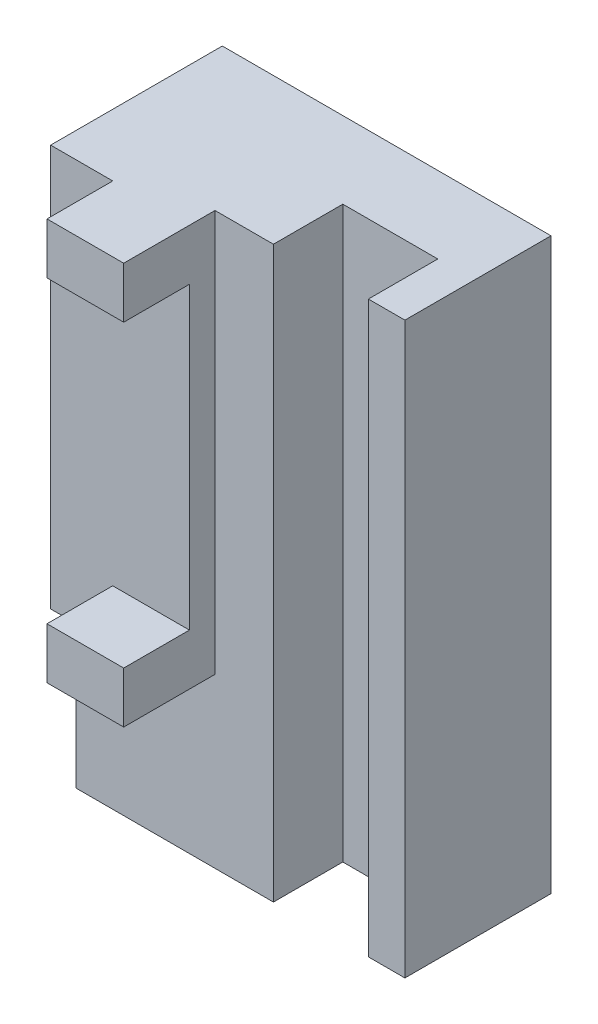
ISO-10303-21;
HEADER;
FILE_DESCRIPTION(('STEP AP214'),'2;1');
FILE_NAME('part.step','',(''),(''),'','','');
FILE_SCHEMA(('AUTOMOTIVE_DESIGN { 1 0 10303 214 1 1 1 1 }'));
ENDSEC;
DATA;
#1=APPLICATION_CONTEXT('core data for automotive mechanical design processes');
#2=APPLICATION_PROTOCOL_DEFINITION('international standard','automotive_design',2000,#1);
#3=PRODUCT_CONTEXT('',#1,'mechanical');
#4=PRODUCT('Part','Part','',(#3));
#5=PRODUCT_RELATED_PRODUCT_CATEGORY('part','',(#4));
#6=PRODUCT_DEFINITION_FORMATION('','',#4);
#7=PRODUCT_DEFINITION_CONTEXT('part definition',#1,'design');
#8=PRODUCT_DEFINITION('design','',#6,#7);
#9=PRODUCT_DEFINITION_SHAPE('','',#8);
#10=(LENGTH_UNIT() NAMED_UNIT(*) SI_UNIT(.MILLI.,.METRE.));
#11=(NAMED_UNIT(*) PLANE_ANGLE_UNIT() SI_UNIT($,.RADIAN.));
#12=(NAMED_UNIT(*) SI_UNIT($,.STERADIAN.) SOLID_ANGLE_UNIT());
#13=UNCERTAINTY_MEASURE_WITH_UNIT(LENGTH_MEASURE(1.E-05),#10,'distance_accuracy_value','');
#14=(GEOMETRIC_REPRESENTATION_CONTEXT(3) GLOBAL_UNCERTAINTY_ASSIGNED_CONTEXT((#13)) GLOBAL_UNIT_ASSIGNED_CONTEXT((#10,
#11,#12)) REPRESENTATION_CONTEXT('',''));
#15=CARTESIAN_POINT('',(0.,0.,0.));
#16=DIRECTION('',(0.,0.,1.));
#17=DIRECTION('',(1.,0.,0.));
#18=AXIS2_PLACEMENT_3D('',#15,#16,#17);
#19=CARTESIAN_POINT('',(0.,0.,20.));
#20=DIRECTION('',(0.,0.,1.));
#21=DIRECTION('',(1.,0.,0.));
#22=AXIS2_PLACEMENT_3D('',#19,#20,#21);
#23=PLANE('',#22);
#24=DIRECTION('',(1.,0.,0.));
#25=VECTOR('',#24,1.);
#26=CARTESIAN_POINT('',(-20.2780898876404,0.575842696629199,20.));
#27=LINE('',#26,#25);
#28=CARTESIAN_POINT('',(-28.7780898876404,0.575842696629199,20.));
#29=VERTEX_POINT('',#28);
#30=CARTESIAN_POINT('',(-9.77808988764043,0.575842696629199,20.));
#31=VERTEX_POINT('',#30);
#32=EDGE_CURVE('E297',#29,#31,#27,.T.);
#33=ORIENTED_EDGE('',*,*,#32,.F.);
#34=DIRECTION('',(0.,-1.,0.));
#35=VECTOR('',#34,1.);
#36=CARTESIAN_POINT('',(-28.7780898876404,55.5758426966292,20.));
#37=LINE('',#36,#35);
#38=CARTESIAN_POINT('',(-28.7780898876404,-22.4241573033708,20.));
#39=VERTEX_POINT('',#38);
#40=EDGE_CURVE('E217',#29,#39,#37,.T.);
#41=ORIENTED_EDGE('',*,*,#40,.T.);
#42=DIRECTION('',(1.,0.,0.));
#43=VECTOR('',#42,1.);
#44=CARTESIAN_POINT('',(-28.7780898876404,-22.4241573033708,20.));
#45=LINE('',#44,#43);
#46=CARTESIAN_POINT('',(-1.77808988764044,-22.4241573033708,20.));
#47=VERTEX_POINT('',#46);
#48=EDGE_CURVE('E221',#39,#47,#45,.T.);
#49=ORIENTED_EDGE('',*,*,#48,.T.);
#50=DIRECTION('',(0.,-1.,0.));
#51=VECTOR('',#50,1.);
#52=CARTESIAN_POINT('',(-1.77808988764044,55.5758426966292,20.));
#53=LINE('',#52,#51);
#54=CARTESIAN_POINT('',(-1.77808988764044,55.5758426966292,20.));
#55=VERTEX_POINT('',#54);
#56=EDGE_CURVE('E208',#55,#47,#53,.T.);
#57=ORIENTED_EDGE('',*,*,#56,.F.);
#58=DIRECTION('',(-1.,0.,0.));
#59=VECTOR('',#58,1.);
#60=CARTESIAN_POINT('',(-28.7780898876404,55.5758426966292,20.));
#61=LINE('',#60,#59);
#62=CARTESIAN_POINT('',(-9.77808988764044,55.5758426966292,20.));
#63=VERTEX_POINT('',#62);
#64=EDGE_CURVE('E226',#55,#63,#61,.T.);
#65=ORIENTED_EDGE('',*,*,#64,.T.);
#66=DIRECTION('',(0.,1.,0.));
#67=VECTOR('',#66,1.);
#68=CARTESIAN_POINT('',(-9.77808988764044,55.5758426966292,20.));
#69=LINE('',#68,#67);
#70=EDGE_CURVE('E180',#31,#63,#69,.T.);
#71=ORIENTED_EDGE('',*,*,#70,.F.);
#72=EDGE_LOOP('',(#33,#41,#49,#57,#65,#71));
#73=FACE_BOUND('',#72,.T.);
#74=ADVANCED_FACE('F34',(#73),#23,.T.);
#75=CARTESIAN_POINT('',(-20.2780898876404,55.5758426966292,23.5));
#76=DIRECTION('',(1.,0.,0.));
#77=DIRECTION('',(0.,1.,0.));
#78=AXIS2_PLACEMENT_3D('',#75,#76,#77);
#79=PLANE('',#78);
#80=DIRECTION('',(0.,1.,0.));
#81=VECTOR('',#80,1.);
#82=CARTESIAN_POINT('',(-20.2780898876404,55.5758426966292,23.5));
#83=LINE('',#82,#81);
#84=CARTESIAN_POINT('',(-20.2780898876404,0.5758426966292,23.5));
#85=VERTEX_POINT('',#84);
#86=CARTESIAN_POINT('',(-20.2780898876404,7.5758426966292,23.5));
#87=VERTEX_POINT('',#86);
#88=EDGE_CURVE('E160',#85,#87,#83,.T.);
#89=ORIENTED_EDGE('',*,*,#88,.F.);
#90=DIRECTION('',(0.,0.,-1.));
#91=VECTOR('',#90,1.);
#92=CARTESIAN_POINT('',(-20.2780898876404,0.575842696629199,23.5));
#93=LINE('',#92,#91);
#94=CARTESIAN_POINT('',(-20.2780898876404,0.575842696629198,32.5));
#95=VERTEX_POINT('',#94);
#96=EDGE_CURVE('E187',#95,#85,#93,.T.);
#97=ORIENTED_EDGE('',*,*,#96,.F.);
#98=DIRECTION('',(0.,-1.,0.));
#99=VECTOR('',#98,1.);
#100=CARTESIAN_POINT('',(-20.2780898876404,0.575842696629198,32.5));
#101=LINE('',#100,#99);
#102=CARTESIAN_POINT('',(-20.2780898876404,7.5758426966292,32.5));
#103=VERTEX_POINT('',#102);
#104=EDGE_CURVE('E285',#103,#95,#101,.T.);
#105=ORIENTED_EDGE('',*,*,#104,.F.);
#106=DIRECTION('',(0.,0.,-1.));
#107=VECTOR('',#106,1.);
#108=CARTESIAN_POINT('',(-20.2780898876404,7.5758426966292,32.5));
#109=LINE('',#108,#107);
#110=EDGE_CURVE('E291',#103,#87,#109,.T.);
#111=ORIENTED_EDGE('',*,*,#110,.T.);
#112=EDGE_LOOP('',(#89,#97,#105,#111));
#113=FACE_BOUND('',#112,.T.);
#114=ADVANCED_FACE('F325',(#113),#79,.F.);
#115=CARTESIAN_POINT('',(-20.2780898876404,48.5758426966292,23.5));
#116=VERTEX_POINT('',#115);
#117=CARTESIAN_POINT('',(-20.2780898876404,55.5758426966292,23.5));
#118=VERTEX_POINT('',#117);
#119=EDGE_CURVE('E150',#116,#118,#83,.T.);
#120=ORIENTED_EDGE('',*,*,#119,.F.);
#121=DIRECTION('',(0.,0.,-1.));
#122=VECTOR('',#121,1.);
#123=CARTESIAN_POINT('',(-20.2780898876404,48.5758426966292,32.5));
#124=LINE('',#123,#122);
#125=CARTESIAN_POINT('',(-20.2780898876404,48.5758426966292,32.5));
#126=VERTEX_POINT('',#125);
#127=EDGE_CURVE('E278',#126,#116,#124,.T.);
#128=ORIENTED_EDGE('',*,*,#127,.F.);
#129=DIRECTION('',(0.,-1.,0.));
#130=VECTOR('',#129,1.);
#131=CARTESIAN_POINT('',(-20.2780898876404,55.5758426966292,32.5));
#132=LINE('',#131,#130);
#133=CARTESIAN_POINT('',(-20.2780898876404,55.5758426966292,32.5));
#134=VERTEX_POINT('',#133);
#135=EDGE_CURVE('E174',#134,#126,#132,.T.);
#136=ORIENTED_EDGE('',*,*,#135,.F.);
#137=DIRECTION('',(0.,0.,-1.));
#138=VECTOR('',#137,1.);
#139=CARTESIAN_POINT('',(-20.2780898876404,55.5758426966292,23.5));
#140=LINE('',#139,#138);
#141=EDGE_CURVE('E165',#134,#118,#140,.T.);
#142=ORIENTED_EDGE('',*,*,#141,.T.);
#143=EDGE_LOOP('',(#120,#128,#136,#142));
#144=FACE_BOUND('',#143,.T.);
#145=ADVANCED_FACE('F172',(#144),#79,.F.);
#146=CARTESIAN_POINT('',(0.,0.,23.5));
#147=DIRECTION('',(0.,0.,1.));
#148=DIRECTION('',(1.,0.,0.));
#149=AXIS2_PLACEMENT_3D('',#146,#147,#148);
#150=PLANE('',#149);
#151=DIRECTION('',(0.,1.,0.));
#152=VECTOR('',#151,1.);
#153=CARTESIAN_POINT('',(-9.77808988764044,55.5758426966292,23.5));
#154=LINE('',#153,#152);
#155=CARTESIAN_POINT('',(-9.77808988764044,7.5758426966292,23.5));
#156=VERTEX_POINT('',#155);
#157=CARTESIAN_POINT('',(-9.77808988764044,48.5758426966292,23.5));
#158=VERTEX_POINT('',#157);
#159=EDGE_CURVE('E49',#156,#158,#154,.T.);
#160=ORIENTED_EDGE('',*,*,#159,.T.);
#161=DIRECTION('',(1.,0.,0.));
#162=VECTOR('',#161,1.);
#163=CARTESIAN_POINT('',(-20.2780898876404,48.5758426966292,23.5));
#164=LINE('',#163,#162);
#165=EDGE_CURVE('E155',#116,#158,#164,.T.);
#166=ORIENTED_EDGE('',*,*,#165,.F.);
#167=ORIENTED_EDGE('',*,*,#119,.T.);
#168=DIRECTION('',(-1.,0.,0.));
#169=VECTOR('',#168,1.);
#170=CARTESIAN_POINT('',(-20.2780898876404,55.5758426966292,23.5));
#171=LINE('',#170,#169);
#172=CARTESIAN_POINT('',(-28.7780898876404,55.5758426966292,23.5));
#173=VERTEX_POINT('',#172);
#174=EDGE_CURVE('E153',#118,#173,#171,.T.);
#175=ORIENTED_EDGE('',*,*,#174,.T.);
#176=DIRECTION('',(0.,-1.,0.));
#177=VECTOR('',#176,1.);
#178=CARTESIAN_POINT('',(-28.7780898876404,55.5758426966292,23.5));
#179=LINE('',#178,#177);
#180=CARTESIAN_POINT('',(-28.7780898876404,0.575842696629199,23.5));
#181=VERTEX_POINT('',#180);
#182=EDGE_CURVE('E169',#173,#181,#179,.T.);
#183=ORIENTED_EDGE('',*,*,#182,.T.);
#184=DIRECTION('',(1.,0.,0.));
#185=VECTOR('',#184,1.);
#186=CARTESIAN_POINT('',(-20.2780898876404,0.5758426966292,23.5));
#187=LINE('',#186,#185);
#188=EDGE_CURVE('E261',#181,#85,#187,.T.);
#189=ORIENTED_EDGE('',*,*,#188,.T.);
#190=ORIENTED_EDGE('',*,*,#88,.T.);
#191=DIRECTION('',(-1.,0.,0.));
#192=VECTOR('',#191,1.);
#193=CARTESIAN_POINT('',(-9.77808988764043,7.5758426966292,23.5));
#194=LINE('',#193,#192);
#195=EDGE_CURVE('E54',#156,#87,#194,.T.);
#196=ORIENTED_EDGE('',*,*,#195,.F.);
#197=EDGE_LOOP('',(#160,#166,#167,#175,#183,#189,#190,#196));
#198=FACE_BOUND('',#197,.T.);
#199=ADVANCED_FACE('F152',(#198),#150,.T.);
#200=CARTESIAN_POINT('',(-28.7780898876404,55.5758426966292,20.));
#201=DIRECTION('',(1.,0.,0.));
#202=DIRECTION('',(0.,1.,0.));
#203=AXIS2_PLACEMENT_3D('',#200,#201,#202);
#204=PLANE('',#203);
#205=DIRECTION('',(0.,-1.,0.));
#206=VECTOR('',#205,1.);
#207=CARTESIAN_POINT('',(-28.7780898876404,55.5758426966292,0.));
#208=LINE('',#207,#206);
#209=CARTESIAN_POINT('',(-28.7780898876404,55.5758426966292,0.));
#210=VERTEX_POINT('',#209);
#211=CARTESIAN_POINT('',(-28.7780898876404,-22.4241573033708,0.));
#212=VERTEX_POINT('',#211);
#213=EDGE_CURVE('E210',#210,#212,#208,.T.);
#214=ORIENTED_EDGE('',*,*,#213,.T.);
#215=DIRECTION('',(0.,0.,-1.));
#216=VECTOR('',#215,1.);
#217=CARTESIAN_POINT('',(-28.7780898876404,-22.4241573033708,20.));
#218=LINE('',#217,#216);
#219=EDGE_CURVE('E11',#39,#212,#218,.T.);
#220=ORIENTED_EDGE('',*,*,#219,.F.);
#221=ORIENTED_EDGE('',*,*,#40,.F.);
#222=DIRECTION('',(0.,0.,-1.));
#223=VECTOR('',#222,1.);
#224=CARTESIAN_POINT('',(-28.7780898876404,0.575842696629199,23.5));
#225=LINE('',#224,#223);
#226=EDGE_CURVE('E259',#181,#29,#225,.T.);
#227=ORIENTED_EDGE('',*,*,#226,.F.);
#228=ORIENTED_EDGE('',*,*,#182,.F.);
#229=DIRECTION('',(0.,0.,-1.));
#230=VECTOR('',#229,1.);
#231=CARTESIAN_POINT('',(-28.7780898876404,55.5758426966292,20.));
#232=LINE('',#231,#230);
#233=EDGE_CURVE('E168',#173,#210,#232,.T.);
#234=ORIENTED_EDGE('',*,*,#233,.T.);
#235=EDGE_LOOP('',(#214,#220,#221,#227,#228,#234));
#236=FACE_BOUND('',#235,.T.);
#237=ADVANCED_FACE('F36',(#236),#204,.F.);
#238=CARTESIAN_POINT('',(-28.7780898876404,-22.4241573033708,20.));
#239=DIRECTION('',(0.,1.,0.));
#240=DIRECTION('',(0.,0.,1.));
#241=AXIS2_PLACEMENT_3D('',#238,#239,#240);
#242=PLANE('',#241);
#243=DIRECTION('',(1.,0.,0.));
#244=VECTOR('',#243,1.);
#245=CARTESIAN_POINT('',(-1.77808988764044,-22.4241573033708,10.5));
#246=LINE('',#245,#244);
#247=CARTESIAN_POINT('',(-1.77808988764044,-22.4241573033708,10.5));
#248=VERTEX_POINT('',#247);
#249=CARTESIAN_POINT('',(11.2219101123596,-22.4241573033708,10.5));
#250=VERTEX_POINT('',#249);
#251=EDGE_CURVE('E204',#248,#250,#246,.T.);
#252=ORIENTED_EDGE('',*,*,#251,.F.);
#253=DIRECTION('',(0.,0.,-1.));
#254=VECTOR('',#253,1.);
#255=CARTESIAN_POINT('',(-1.77808988764044,-22.4241573033708,20.));
#256=LINE('',#255,#254);
#257=EDGE_CURVE('E190',#47,#248,#256,.T.);
#258=ORIENTED_EDGE('',*,*,#257,.F.);
#259=ORIENTED_EDGE('',*,*,#48,.F.);
#260=ORIENTED_EDGE('',*,*,#219,.T.);
#261=DIRECTION('',(1.,0.,0.));
#262=VECTOR('',#261,1.);
#263=CARTESIAN_POINT('',(-28.7780898876404,-22.4241573033708,0.));
#264=LINE('',#263,#262);
#265=CARTESIAN_POINT('',(16.2219101123596,-22.4241573033708,0.));
#266=VERTEX_POINT('',#265);
#267=EDGE_CURVE('E232',#212,#266,#264,.T.);
#268=ORIENTED_EDGE('',*,*,#267,.T.);
#269=DIRECTION('',(0.,0.,-1.));
#270=VECTOR('',#269,1.);
#271=CARTESIAN_POINT('',(16.2219101123596,-22.4241573033708,20.));
#272=LINE('',#271,#270);
#273=CARTESIAN_POINT('',(16.2219101123596,-22.4241573033708,20.));
#274=VERTEX_POINT('',#273);
#275=EDGE_CURVE('E42',#274,#266,#272,.T.);
#276=ORIENTED_EDGE('',*,*,#275,.F.);
#277=CARTESIAN_POINT('',(11.2219101123595,-22.4241573033708,20.));
#278=VERTEX_POINT('',#277);
#279=EDGE_CURVE('E219',#278,#274,#45,.T.);
#280=ORIENTED_EDGE('',*,*,#279,.F.);
#281=DIRECTION('',(0.,0.,1.));
#282=VECTOR('',#281,1.);
#283=CARTESIAN_POINT('',(11.2219101123596,-22.4241573033708,20.));
#284=LINE('',#283,#282);
#285=EDGE_CURVE('E195',#250,#278,#284,.T.);
#286=ORIENTED_EDGE('',*,*,#285,.F.);
#287=EDGE_LOOP('',(#252,#258,#259,#260,#268,#276,#280,#286));
#288=FACE_BOUND('',#287,.T.);
#289=ADVANCED_FACE('F347',(#288),#242,.F.);
#290=CARTESIAN_POINT('',(16.2219101123596,55.5758426966292,20.));
#291=DIRECTION('',(-1.,0.,0.));
#292=DIRECTION('',(0.,-1.,0.));
#293=AXIS2_PLACEMENT_3D('',#290,#291,#292);
#294=PLANE('',#293);
#295=DIRECTION('',(0.,1.,0.));
#296=VECTOR('',#295,1.);
#297=CARTESIAN_POINT('',(16.2219101123596,55.5758426966292,0.));
#298=LINE('',#297,#296);
#299=CARTESIAN_POINT('',(16.2219101123596,55.5758426966292,0.));
#300=VERTEX_POINT('',#299);
#301=EDGE_CURVE('E234',#266,#300,#298,.T.);
#302=ORIENTED_EDGE('',*,*,#301,.T.);
#303=DIRECTION('',(0.,0.,-1.));
#304=VECTOR('',#303,1.);
#305=CARTESIAN_POINT('',(16.2219101123596,55.5758426966292,20.));
#306=LINE('',#305,#304);
#307=CARTESIAN_POINT('',(16.2219101123596,55.5758426966292,20.));
#308=VERTEX_POINT('',#307);
#309=EDGE_CURVE('E238',#308,#300,#306,.T.);
#310=ORIENTED_EDGE('',*,*,#309,.F.);
#311=DIRECTION('',(0.,1.,0.));
#312=VECTOR('',#311,1.);
#313=CARTESIAN_POINT('',(16.2219101123596,55.5758426966292,20.));
#314=LINE('',#313,#312);
#315=EDGE_CURVE('E224',#274,#308,#314,.T.);
#316=ORIENTED_EDGE('',*,*,#315,.F.);
#317=ORIENTED_EDGE('',*,*,#275,.T.);
#318=EDGE_LOOP('',(#302,#310,#316,#317));
#319=FACE_BOUND('',#318,.T.);
#320=ADVANCED_FACE('F245',(#319),#294,.F.);
#321=CARTESIAN_POINT('',(-28.7780898876404,55.5758426966292,20.));
#322=DIRECTION('',(0.,-1.,0.));
#323=DIRECTION('',(0.,0.,-1.));
#324=AXIS2_PLACEMENT_3D('',#321,#322,#323);
#325=PLANE('',#324);
#326=ORIENTED_EDGE('',*,*,#233,.F.);
#327=ORIENTED_EDGE('',*,*,#174,.F.);
#328=ORIENTED_EDGE('',*,*,#141,.F.);
#329=DIRECTION('',(-1.,0.,0.));
#330=VECTOR('',#329,1.);
#331=CARTESIAN_POINT('',(-20.2780898876404,55.5758426966292,32.5));
#332=LINE('',#331,#330);
#333=CARTESIAN_POINT('',(-9.77808988764043,55.5758426966292,32.5));
#334=VERTEX_POINT('',#333);
#335=EDGE_CURVE('E272',#334,#134,#332,.T.);
#336=ORIENTED_EDGE('',*,*,#335,.F.);
#337=DIRECTION('',(0.,0.,-1.));
#338=VECTOR('',#337,1.);
#339=CARTESIAN_POINT('',(-9.77808988764044,55.5758426966292,23.5));
#340=LINE('',#339,#338);
#341=EDGE_CURVE('E175',#334,#63,#340,.T.);
#342=ORIENTED_EDGE('',*,*,#341,.T.);
#343=ORIENTED_EDGE('',*,*,#64,.F.);
#344=DIRECTION('',(0.,0.,-1.));
#345=VECTOR('',#344,1.);
#346=CARTESIAN_POINT('',(-1.77808988764044,55.5758426966292,20.));
#347=LINE('',#346,#345);
#348=CARTESIAN_POINT('',(-1.77808988764044,55.5758426966292,10.5));
#349=VERTEX_POINT('',#348);
#350=EDGE_CURVE('E191',#55,#349,#347,.T.);
#351=ORIENTED_EDGE('',*,*,#350,.T.);
#352=DIRECTION('',(1.,0.,0.));
#353=VECTOR('',#352,1.);
#354=CARTESIAN_POINT('',(-1.77808988764044,55.5758426966292,10.5));
#355=LINE('',#354,#353);
#356=CARTESIAN_POINT('',(11.2219101123596,55.5758426966292,10.5));
#357=VERTEX_POINT('',#356);
#358=EDGE_CURVE('E194',#349,#357,#355,.T.);
#359=ORIENTED_EDGE('',*,*,#358,.T.);
#360=DIRECTION('',(0.,0.,1.));
#361=VECTOR('',#360,1.);
#362=CARTESIAN_POINT('',(11.2219101123596,55.5758426966292,20.));
#363=LINE('',#362,#361);
#364=CARTESIAN_POINT('',(11.2219101123596,55.5758426966292,20.));
#365=VERTEX_POINT('',#364);
#366=EDGE_CURVE('E198',#357,#365,#363,.T.);
#367=ORIENTED_EDGE('',*,*,#366,.T.);
#368=EDGE_CURVE('E227',#308,#365,#61,.T.);
#369=ORIENTED_EDGE('',*,*,#368,.F.);
#370=ORIENTED_EDGE('',*,*,#309,.T.);
#371=DIRECTION('',(-1.,0.,0.));
#372=VECTOR('',#371,1.);
#373=CARTESIAN_POINT('',(-28.7780898876404,55.5758426966292,0.));
#374=LINE('',#373,#372);
#375=EDGE_CURVE('E220',#300,#210,#374,.T.);
#376=ORIENTED_EDGE('',*,*,#375,.T.);
#377=EDGE_LOOP('',(#326,#327,#328,#336,#342,#343,#351,#359,#367,#369,#370,#376));
#378=FACE_BOUND('',#377,.T.);
#379=ADVANCED_FACE('F163',(#378),#325,.F.);
#380=DIRECTION('',(0.,-1.,0.));
#381=VECTOR('',#380,1.);
#382=CARTESIAN_POINT('',(11.2219101123596,55.5758426966292,20.));
#383=LINE('',#382,#381);
#384=EDGE_CURVE('E211',#365,#278,#383,.T.);
#385=ORIENTED_EDGE('',*,*,#384,.T.);
#386=ORIENTED_EDGE('',*,*,#279,.T.);
#387=ORIENTED_EDGE('',*,*,#315,.T.);
#388=ORIENTED_EDGE('',*,*,#368,.T.);
#389=EDGE_LOOP('',(#385,#386,#387,#388));
#390=FACE_BOUND('',#389,.T.);
#391=ADVANCED_FACE('F327',(#390),#23,.T.);
#392=CARTESIAN_POINT('',(0.,0.,0.));
#393=DIRECTION('',(0.,0.,1.));
#394=DIRECTION('',(1.,0.,0.));
#395=AXIS2_PLACEMENT_3D('',#392,#393,#394);
#396=PLANE('',#395);
#397=ORIENTED_EDGE('',*,*,#213,.F.);
#398=ORIENTED_EDGE('',*,*,#375,.F.);
#399=ORIENTED_EDGE('',*,*,#301,.F.);
#400=ORIENTED_EDGE('',*,*,#267,.F.);
#401=EDGE_LOOP('',(#397,#398,#399,#400));
#402=FACE_BOUND('',#401,.T.);
#403=ADVANCED_FACE('F252',(#402),#396,.F.);
#404=CARTESIAN_POINT('',(-1.77808988764044,55.5758426966292,20.));
#405=DIRECTION('',(-1.,0.,0.));
#406=DIRECTION('',(0.,0.,1.));
#407=AXIS2_PLACEMENT_3D('',#404,#405,#406);
#408=PLANE('',#407);
#409=ORIENTED_EDGE('',*,*,#257,.T.);
#410=DIRECTION('',(0.,-1.,0.));
#411=VECTOR('',#410,1.);
#412=CARTESIAN_POINT('',(-1.77808988764044,55.5758426966292,10.5));
#413=LINE('',#412,#411);
#414=EDGE_CURVE('E201',#349,#248,#413,.T.);
#415=ORIENTED_EDGE('',*,*,#414,.F.);
#416=ORIENTED_EDGE('',*,*,#350,.F.);
#417=ORIENTED_EDGE('',*,*,#56,.T.);
#418=EDGE_LOOP('',(#409,#415,#416,#417));
#419=FACE_BOUND('',#418,.T.);
#420=ADVANCED_FACE('F341',(#419),#408,.F.);
#421=CARTESIAN_POINT('',(11.2219101123596,55.5758426966292,20.));
#422=DIRECTION('',(1.,0.,0.));
#423=DIRECTION('',(0.,0.,-1.));
#424=AXIS2_PLACEMENT_3D('',#421,#422,#423);
#425=PLANE('',#424);
#426=ORIENTED_EDGE('',*,*,#285,.T.);
#427=ORIENTED_EDGE('',*,*,#384,.F.);
#428=ORIENTED_EDGE('',*,*,#366,.F.);
#429=DIRECTION('',(0.,-1.,0.));
#430=VECTOR('',#429,1.);
#431=CARTESIAN_POINT('',(11.2219101123596,55.5758426966292,10.5));
#432=LINE('',#431,#430);
#433=EDGE_CURVE('E214',#357,#250,#432,.T.);
#434=ORIENTED_EDGE('',*,*,#433,.T.);
#435=EDGE_LOOP('',(#426,#427,#428,#434));
#436=FACE_BOUND('',#435,.T.);
#437=ADVANCED_FACE('F349',(#436),#425,.F.);
#438=CARTESIAN_POINT('',(-1.77808988764044,55.5758426966292,10.5));
#439=DIRECTION('',(0.,0.,-1.));
#440=DIRECTION('',(-1.,0.,0.));
#441=AXIS2_PLACEMENT_3D('',#438,#439,#440);
#442=PLANE('',#441);
#443=ORIENTED_EDGE('',*,*,#251,.T.);
#444=ORIENTED_EDGE('',*,*,#433,.F.);
#445=ORIENTED_EDGE('',*,*,#358,.F.);
#446=ORIENTED_EDGE('',*,*,#414,.T.);
#447=EDGE_LOOP('',(#443,#444,#445,#446));
#448=FACE_BOUND('',#447,.T.);
#449=ADVANCED_FACE('F352',(#448),#442,.F.);
#450=CARTESIAN_POINT('',(-20.2780898876404,0.575842696629199,23.5));
#451=DIRECTION('',(0.,1.,0.));
#452=DIRECTION('',(0.,0.,1.));
#453=AXIS2_PLACEMENT_3D('',#450,#451,#452);
#454=PLANE('',#453);
#455=ORIENTED_EDGE('',*,*,#32,.T.);
#456=DIRECTION('',(0.,0.,-1.));
#457=VECTOR('',#456,1.);
#458=CARTESIAN_POINT('',(-9.77808988764043,0.575842696629199,23.5));
#459=LINE('',#458,#457);
#460=CARTESIAN_POINT('',(-9.77808988764043,0.575842696629199,32.5));
#461=VERTEX_POINT('',#460);
#462=EDGE_CURVE('E178',#461,#31,#459,.T.);
#463=ORIENTED_EDGE('',*,*,#462,.F.);
#464=DIRECTION('',(1.,0.,0.));
#465=VECTOR('',#464,1.);
#466=CARTESIAN_POINT('',(-9.77808988764043,0.575842696629199,32.5));
#467=LINE('',#466,#465);
#468=EDGE_CURVE('E288',#95,#461,#467,.T.);
#469=ORIENTED_EDGE('',*,*,#468,.F.);
#470=ORIENTED_EDGE('',*,*,#96,.T.);
#471=ORIENTED_EDGE('',*,*,#188,.F.);
#472=ORIENTED_EDGE('',*,*,#226,.T.);
#473=EDGE_LOOP('',(#455,#463,#469,#470,#471,#472));
#474=FACE_BOUND('',#473,.T.);
#475=ADVANCED_FACE('F356',(#474),#454,.F.);
#476=CARTESIAN_POINT('',(-9.77808988764044,55.5758426966292,23.5));
#477=DIRECTION('',(-1.,0.,0.));
#478=DIRECTION('',(0.,-1.,0.));
#479=AXIS2_PLACEMENT_3D('',#476,#477,#478);
#480=PLANE('',#479);
#481=ORIENTED_EDGE('',*,*,#70,.T.);
#482=ORIENTED_EDGE('',*,*,#341,.F.);
#483=DIRECTION('',(0.,1.,0.));
#484=VECTOR('',#483,1.);
#485=CARTESIAN_POINT('',(-9.77808988764043,55.5758426966292,32.5));
#486=LINE('',#485,#484);
#487=CARTESIAN_POINT('',(-9.77808988764043,48.5758426966292,32.5));
#488=VERTEX_POINT('',#487);
#489=EDGE_CURVE('E269',#488,#334,#486,.T.);
#490=ORIENTED_EDGE('',*,*,#489,.F.);
#491=DIRECTION('',(0.,0.,-1.));
#492=VECTOR('',#491,1.);
#493=CARTESIAN_POINT('',(-9.77808988764043,48.5758426966292,32.5));
#494=LINE('',#493,#492);
#495=EDGE_CURVE('E274',#488,#158,#494,.T.);
#496=ORIENTED_EDGE('',*,*,#495,.T.);
#497=ORIENTED_EDGE('',*,*,#159,.F.);
#498=DIRECTION('',(0.,0.,-1.));
#499=VECTOR('',#498,1.);
#500=CARTESIAN_POINT('',(-9.77808988764043,7.5758426966292,32.5));
#501=LINE('',#500,#499);
#502=CARTESIAN_POINT('',(-9.77808988764043,7.5758426966292,32.5));
#503=VERTEX_POINT('',#502);
#504=EDGE_CURVE('E295',#503,#156,#501,.T.);
#505=ORIENTED_EDGE('',*,*,#504,.F.);
#506=DIRECTION('',(0.,1.,0.));
#507=VECTOR('',#506,1.);
#508=CARTESIAN_POINT('',(-9.77808988764043,0.575842696629199,32.5));
#509=LINE('',#508,#507);
#510=EDGE_CURVE('E280',#461,#503,#509,.T.);
#511=ORIENTED_EDGE('',*,*,#510,.F.);
#512=ORIENTED_EDGE('',*,*,#462,.T.);
#513=EDGE_LOOP('',(#481,#482,#490,#496,#497,#505,#511,#512));
#514=FACE_BOUND('',#513,.T.);
#515=ADVANCED_FACE('F302',(#514),#480,.F.);
#516=CARTESIAN_POINT('',(-9.77808988764043,7.5758426966292,32.5));
#517=DIRECTION('',(0.,-1.,0.));
#518=DIRECTION('',(1.,0.,0.));
#519=AXIS2_PLACEMENT_3D('',#516,#517,#518);
#520=PLANE('',#519);
#521=ORIENTED_EDGE('',*,*,#195,.T.);
#522=ORIENTED_EDGE('',*,*,#110,.F.);
#523=DIRECTION('',(-1.,0.,0.));
#524=VECTOR('',#523,1.);
#525=CARTESIAN_POINT('',(-9.77808988764043,7.5758426966292,32.5));
#526=LINE('',#525,#524);
#527=EDGE_CURVE('E283',#503,#103,#526,.T.);
#528=ORIENTED_EDGE('',*,*,#527,.F.);
#529=ORIENTED_EDGE('',*,*,#504,.T.);
#530=EDGE_LOOP('',(#521,#522,#528,#529));
#531=FACE_BOUND('',#530,.T.);
#532=ADVANCED_FACE('F321',(#531),#520,.F.);
#533=CARTESIAN_POINT('',(0.,0.,32.5));
#534=DIRECTION('',(0.,0.,1.));
#535=DIRECTION('',(1.,0.,0.));
#536=AXIS2_PLACEMENT_3D('',#533,#534,#535);
#537=PLANE('',#536);
#538=ORIENTED_EDGE('',*,*,#510,.T.);
#539=ORIENTED_EDGE('',*,*,#527,.T.);
#540=ORIENTED_EDGE('',*,*,#104,.T.);
#541=ORIENTED_EDGE('',*,*,#468,.T.);
#542=EDGE_LOOP('',(#538,#539,#540,#541));
#543=FACE_BOUND('',#542,.T.);
#544=ADVANCED_FACE('F314',(#543),#537,.T.);
#545=CARTESIAN_POINT('',(-20.2780898876404,48.5758426966292,32.5));
#546=DIRECTION('',(0.,1.,0.));
#547=DIRECTION('',(0.,0.,1.));
#548=AXIS2_PLACEMENT_3D('',#545,#546,#547);
#549=PLANE('',#548);
#550=ORIENTED_EDGE('',*,*,#165,.T.);
#551=ORIENTED_EDGE('',*,*,#495,.F.);
#552=DIRECTION('',(1.,0.,0.));
#553=VECTOR('',#552,1.);
#554=CARTESIAN_POINT('',(-20.2780898876404,48.5758426966292,32.5));
#555=LINE('',#554,#553);
#556=EDGE_CURVE('E267',#126,#488,#555,.T.);
#557=ORIENTED_EDGE('',*,*,#556,.F.);
#558=ORIENTED_EDGE('',*,*,#127,.T.);
#559=EDGE_LOOP('',(#550,#551,#557,#558));
#560=FACE_BOUND('',#559,.T.);
#561=ADVANCED_FACE('F312',(#560),#549,.F.);
#562=CARTESIAN_POINT('',(0.,0.,32.5));
#563=DIRECTION('',(0.,0.,1.));
#564=DIRECTION('',(1.,0.,0.));
#565=AXIS2_PLACEMENT_3D('',#562,#563,#564);
#566=PLANE('',#565);
#567=ORIENTED_EDGE('',*,*,#135,.T.);
#568=ORIENTED_EDGE('',*,*,#556,.T.);
#569=ORIENTED_EDGE('',*,*,#489,.T.);
#570=ORIENTED_EDGE('',*,*,#335,.T.);
#571=EDGE_LOOP('',(#567,#568,#569,#570));
#572=FACE_BOUND('',#571,.T.);
#573=ADVANCED_FACE('F308',(#572),#566,.T.);
#574=CLOSED_SHELL('',(#74,#114,#145,#199,#237,#289,#320,#379,#391,#403,#420,#437,#449,#475,#515,
#532,#544,#561,#573));
#575=MANIFOLD_SOLID_BREP('B2',#574);
#576=ADVANCED_BREP_SHAPE_REPRESENTATION('',(#18,#575),#14);
#577=SHAPE_DEFINITION_REPRESENTATION(#9,#576);
ENDSEC;
END-ISO-10303-21;
